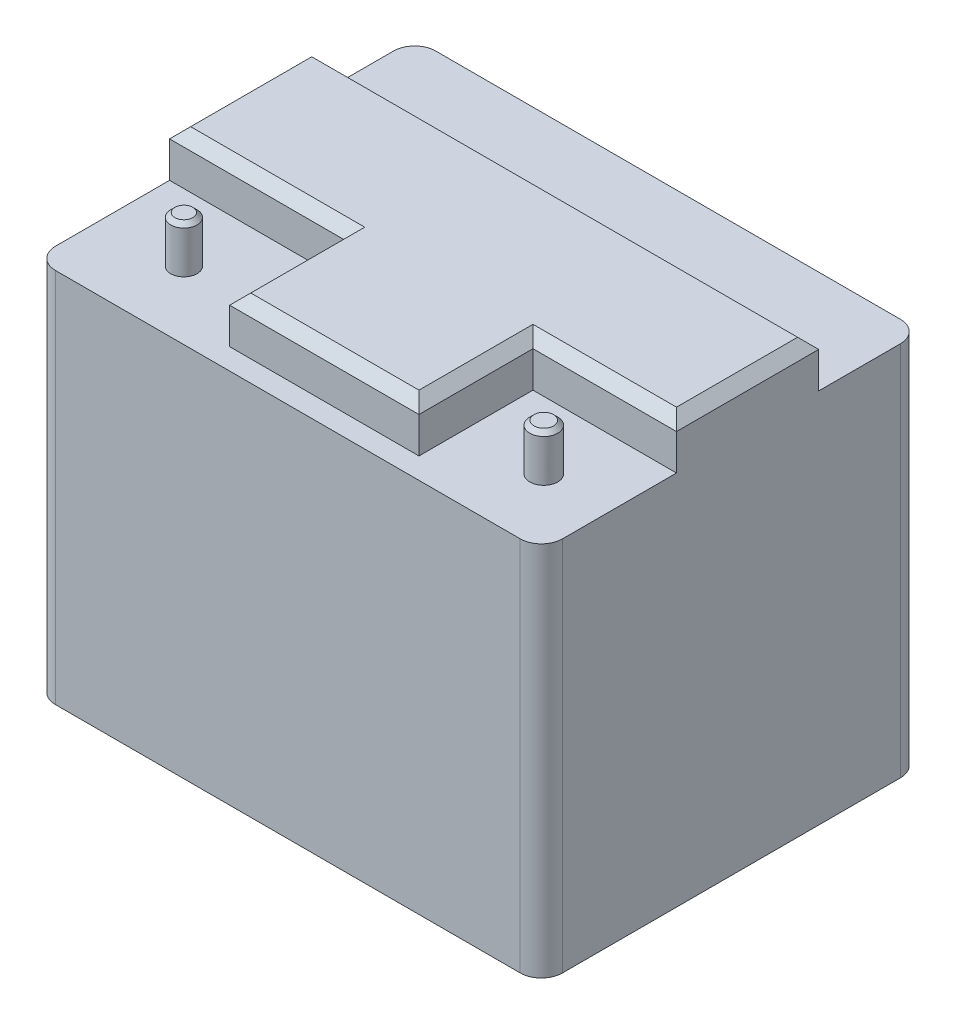
ISO-10303-21;
HEADER;
FILE_DESCRIPTION(('STEP AP214'),'2;1');
FILE_NAME('part.step','',(''),(''),'','','');
FILE_SCHEMA(('AUTOMOTIVE_DESIGN { 1 0 10303 214 1 1 1 1 }'));
ENDSEC;
DATA;
#1=APPLICATION_CONTEXT('core data for automotive mechanical design processes');
#2=APPLICATION_PROTOCOL_DEFINITION('international standard','automotive_design',2000,#1);
#3=PRODUCT_CONTEXT('',#1,'mechanical');
#4=PRODUCT('Part','Part','',(#3));
#5=PRODUCT_RELATED_PRODUCT_CATEGORY('part','',(#4));
#6=PRODUCT_DEFINITION_FORMATION('','',#4);
#7=PRODUCT_DEFINITION_CONTEXT('part definition',#1,'design');
#8=PRODUCT_DEFINITION('design','',#6,#7);
#9=PRODUCT_DEFINITION_SHAPE('','',#8);
#10=(LENGTH_UNIT() NAMED_UNIT(*) SI_UNIT(.MILLI.,.METRE.));
#11=(NAMED_UNIT(*) PLANE_ANGLE_UNIT() SI_UNIT($,.RADIAN.));
#12=(NAMED_UNIT(*) SI_UNIT($,.STERADIAN.) SOLID_ANGLE_UNIT());
#13=UNCERTAINTY_MEASURE_WITH_UNIT(LENGTH_MEASURE(1.E-05),#10,'distance_accuracy_value','');
#14=(GEOMETRIC_REPRESENTATION_CONTEXT(3) GLOBAL_UNCERTAINTY_ASSIGNED_CONTEXT((#13)) GLOBAL_UNIT_ASSIGNED_CONTEXT((#10,
#11,#12)) REPRESENTATION_CONTEXT('',''));
#15=CARTESIAN_POINT('',(0.,0.,0.));
#16=DIRECTION('',(0.,0.,1.));
#17=DIRECTION('',(1.,0.,0.));
#18=AXIS2_PLACEMENT_3D('',#15,#16,#17);
#19=CARTESIAN_POINT('',(-110.,200.,80.));
#20=DIRECTION('',(0.,-1.,0.));
#21=DIRECTION('',(0.,0.,-1.));
#22=AXIS2_PLACEMENT_3D('',#19,#20,#21);
#23=CYLINDRICAL_SURFACE('',#22,10.);
#24=CARTESIAN_POINT('',(-110.,178.,80.));
#25=DIRECTION('',(0.,1.,0.));
#26=DIRECTION('',(0.,0.,1.));
#27=AXIS2_PLACEMENT_3D('',#24,#25,#26);
#28=CIRCLE('',#27,10.);
#29=CARTESIAN_POINT('',(-120.,178.,79.9999999999999));
#30=VERTEX_POINT('',#29);
#31=CARTESIAN_POINT('',(-110.,178.,90.));
#32=VERTEX_POINT('',#31);
#33=EDGE_CURVE('E212',#30,#32,#28,.T.);
#34=ORIENTED_EDGE('',*,*,#33,.F.);
#35=DIRECTION('',(0.,-1.,0.));
#36=VECTOR('',#35,1.);
#37=CARTESIAN_POINT('',(-120.,200.,79.9999999999999));
#38=LINE('',#37,#36);
#39=CARTESIAN_POINT('',(-120.,0.,79.9999999999999));
#40=VERTEX_POINT('',#39);
#41=EDGE_CURVE('E281',#30,#40,#38,.T.);
#42=ORIENTED_EDGE('',*,*,#41,.T.);
#43=CARTESIAN_POINT('',(-110.,0.,80.));
#44=DIRECTION('',(0.,1.,0.));
#45=DIRECTION('',(0.,0.,1.));
#46=AXIS2_PLACEMENT_3D('',#43,#44,#45);
#47=CIRCLE('',#46,10.);
#48=CARTESIAN_POINT('',(-110.,0.,90.));
#49=VERTEX_POINT('',#48);
#50=EDGE_CURVE('E261',#40,#49,#47,.T.);
#51=ORIENTED_EDGE('',*,*,#50,.T.);
#52=DIRECTION('',(0.,-1.,0.));
#53=VECTOR('',#52,1.);
#54=CARTESIAN_POINT('',(-110.,200.,90.));
#55=LINE('',#54,#53);
#56=EDGE_CURVE('E279',#32,#49,#55,.T.);
#57=ORIENTED_EDGE('',*,*,#56,.F.);
#58=EDGE_LOOP('',(#34,#42,#51,#57));
#59=FACE_BOUND('',#58,.T.);
#60=ADVANCED_FACE('F35',(#59),#23,.T.);
#61=CARTESIAN_POINT('',(-110.,200.,90.));
#62=DIRECTION('',(0.,0.,-1.));
#63=DIRECTION('',(-1.,0.,0.));
#64=AXIS2_PLACEMENT_3D('',#61,#62,#63);
#65=PLANE('',#64);
#66=DIRECTION('',(1.,0.,0.));
#67=VECTOR('',#66,1.);
#68=CARTESIAN_POINT('',(0.,178.,90.));
#69=LINE('',#68,#67);
#70=CARTESIAN_POINT('',(110.,178.,90.));
#71=VERTEX_POINT('',#70);
#72=EDGE_CURVE('E214',#32,#71,#69,.T.);
#73=ORIENTED_EDGE('',*,*,#72,.F.);
#74=ORIENTED_EDGE('',*,*,#56,.T.);
#75=DIRECTION('',(1.,0.,0.));
#76=VECTOR('',#75,1.);
#77=CARTESIAN_POINT('',(-110.,0.,90.));
#78=LINE('',#77,#76);
#79=CARTESIAN_POINT('',(110.,0.,90.));
#80=VERTEX_POINT('',#79);
#81=EDGE_CURVE('E264',#49,#80,#78,.T.);
#82=ORIENTED_EDGE('',*,*,#81,.T.);
#83=DIRECTION('',(0.,-1.,0.));
#84=VECTOR('',#83,1.);
#85=CARTESIAN_POINT('',(110.,200.,90.));
#86=LINE('',#85,#84);
#87=EDGE_CURVE('E277',#71,#80,#86,.T.);
#88=ORIENTED_EDGE('',*,*,#87,.F.);
#89=EDGE_LOOP('',(#73,#74,#82,#88));
#90=FACE_BOUND('',#89,.T.);
#91=ADVANCED_FACE('F381',(#90),#65,.F.);
#92=CARTESIAN_POINT('',(110.,200.,80.));
#93=DIRECTION('',(0.,-1.,0.));
#94=DIRECTION('',(0.,0.,-1.));
#95=AXIS2_PLACEMENT_3D('',#92,#93,#94);
#96=CYLINDRICAL_SURFACE('',#95,9.99999999999999);
#97=CARTESIAN_POINT('',(110.,178.,80.));
#98=DIRECTION('',(0.,1.,0.));
#99=DIRECTION('',(0.,0.,1.));
#100=AXIS2_PLACEMENT_3D('',#97,#98,#99);
#101=CIRCLE('',#100,9.99999999999999);
#102=CARTESIAN_POINT('',(120.,178.,79.9999999999999));
#103=VERTEX_POINT('',#102);
#104=EDGE_CURVE('E216',#71,#103,#101,.T.);
#105=ORIENTED_EDGE('',*,*,#104,.F.);
#106=ORIENTED_EDGE('',*,*,#87,.T.);
#107=CARTESIAN_POINT('',(110.,0.,80.));
#108=DIRECTION('',(0.,1.,0.));
#109=DIRECTION('',(0.,0.,1.));
#110=AXIS2_PLACEMENT_3D('',#107,#108,#109);
#111=CIRCLE('',#110,9.99999999999999);
#112=CARTESIAN_POINT('',(120.,0.,79.9999999999999));
#113=VERTEX_POINT('',#112);
#114=EDGE_CURVE('E267',#80,#113,#111,.T.);
#115=ORIENTED_EDGE('',*,*,#114,.T.);
#116=DIRECTION('',(0.,-1.,0.));
#117=VECTOR('',#116,1.);
#118=CARTESIAN_POINT('',(120.,200.,79.9999999999999));
#119=LINE('',#118,#117);
#120=EDGE_CURVE('E275',#103,#113,#119,.T.);
#121=ORIENTED_EDGE('',*,*,#120,.F.);
#122=EDGE_LOOP('',(#105,#106,#115,#121));
#123=FACE_BOUND('',#122,.T.);
#124=ADVANCED_FACE('F387',(#123),#96,.T.);
#125=CARTESIAN_POINT('',(110.,200.,-80.));
#126=DIRECTION('',(0.,-1.,0.));
#127=DIRECTION('',(0.,0.,-1.));
#128=AXIS2_PLACEMENT_3D('',#125,#126,#127);
#129=CYLINDRICAL_SURFACE('',#128,9.99999999999999);
#130=CARTESIAN_POINT('',(110.,178.,-80.));
#131=DIRECTION('',(0.,1.,0.));
#132=DIRECTION('',(0.,0.,1.));
#133=AXIS2_PLACEMENT_3D('',#130,#131,#132);
#134=CIRCLE('',#133,9.99999999999999);
#135=CARTESIAN_POINT('',(120.,178.,-79.9999999999999));
#136=VERTEX_POINT('',#135);
#137=CARTESIAN_POINT('',(110.,178.,-90.));
#138=VERTEX_POINT('',#137);
#139=EDGE_CURVE('E238',#136,#138,#134,.T.);
#140=ORIENTED_EDGE('',*,*,#139,.F.);
#141=DIRECTION('',(0.,-1.,0.));
#142=VECTOR('',#141,1.);
#143=CARTESIAN_POINT('',(120.,200.,-79.9999999999999));
#144=LINE('',#143,#142);
#145=CARTESIAN_POINT('',(120.,0.,-79.9999999999999));
#146=VERTEX_POINT('',#145);
#147=EDGE_CURVE('E273',#136,#146,#144,.T.);
#148=ORIENTED_EDGE('',*,*,#147,.T.);
#149=CARTESIAN_POINT('',(110.,0.,-80.));
#150=DIRECTION('',(0.,1.,0.));
#151=DIRECTION('',(0.,0.,-1.));
#152=AXIS2_PLACEMENT_3D('',#149,#150,#151);
#153=CIRCLE('',#152,9.99999999999999);
#154=CARTESIAN_POINT('',(110.,0.,-90.));
#155=VERTEX_POINT('',#154);
#156=EDGE_CURVE('E248',#146,#155,#153,.T.);
#157=ORIENTED_EDGE('',*,*,#156,.T.);
#158=DIRECTION('',(0.,-1.,0.));
#159=VECTOR('',#158,1.);
#160=CARTESIAN_POINT('',(110.,200.,-90.));
#161=LINE('',#160,#159);
#162=EDGE_CURVE('E287',#138,#155,#161,.T.);
#163=ORIENTED_EDGE('',*,*,#162,.F.);
#164=EDGE_LOOP('',(#140,#148,#157,#163));
#165=FACE_BOUND('',#164,.T.);
#166=ADVANCED_FACE('F404',(#165),#129,.T.);
#167=CARTESIAN_POINT('',(-110.,200.,-90.));
#168=DIRECTION('',(0.,0.,1.));
#169=DIRECTION('',(1.,0.,0.));
#170=AXIS2_PLACEMENT_3D('',#167,#168,#169);
#171=PLANE('',#170);
#172=DIRECTION('',(-1.,0.,0.));
#173=VECTOR('',#172,1.);
#174=CARTESIAN_POINT('',(0.,178.,-90.));
#175=LINE('',#174,#173);
#176=CARTESIAN_POINT('',(-110.,178.,-90.));
#177=VERTEX_POINT('',#176);
#178=EDGE_CURVE('E240',#138,#177,#175,.T.);
#179=ORIENTED_EDGE('',*,*,#178,.F.);
#180=ORIENTED_EDGE('',*,*,#162,.T.);
#181=DIRECTION('',(-1.,0.,0.));
#182=VECTOR('',#181,1.);
#183=CARTESIAN_POINT('',(-110.,0.,-90.));
#184=LINE('',#183,#182);
#185=CARTESIAN_POINT('',(-110.,0.,-90.));
#186=VERTEX_POINT('',#185);
#187=EDGE_CURVE('E252',#155,#186,#184,.T.);
#188=ORIENTED_EDGE('',*,*,#187,.T.);
#189=DIRECTION('',(0.,-1.,0.));
#190=VECTOR('',#189,1.);
#191=CARTESIAN_POINT('',(-110.,200.,-90.));
#192=LINE('',#191,#190);
#193=EDGE_CURVE('E285',#177,#186,#192,.T.);
#194=ORIENTED_EDGE('',*,*,#193,.F.);
#195=EDGE_LOOP('',(#179,#180,#188,#194));
#196=FACE_BOUND('',#195,.T.);
#197=ADVANCED_FACE('F400',(#196),#171,.F.);
#198=CARTESIAN_POINT('',(-110.,200.,-80.));
#199=DIRECTION('',(0.,-1.,0.));
#200=DIRECTION('',(0.,0.,-1.));
#201=AXIS2_PLACEMENT_3D('',#198,#199,#200);
#202=CYLINDRICAL_SURFACE('',#201,10.);
#203=CARTESIAN_POINT('',(-110.,178.,-80.));
#204=DIRECTION('',(0.,1.,0.));
#205=DIRECTION('',(0.,0.,1.));
#206=AXIS2_PLACEMENT_3D('',#203,#204,#205);
#207=CIRCLE('',#206,10.);
#208=CARTESIAN_POINT('',(-120.,178.,-79.9999999999999));
#209=VERTEX_POINT('',#208);
#210=EDGE_CURVE('E242',#177,#209,#207,.T.);
#211=ORIENTED_EDGE('',*,*,#210,.F.);
#212=ORIENTED_EDGE('',*,*,#193,.T.);
#213=CARTESIAN_POINT('',(-110.,0.,-80.));
#214=DIRECTION('',(0.,1.,0.));
#215=DIRECTION('',(0.,0.,1.));
#216=AXIS2_PLACEMENT_3D('',#213,#214,#215);
#217=CIRCLE('',#216,10.);
#218=CARTESIAN_POINT('',(-120.,0.,-79.9999999999999));
#219=VERTEX_POINT('',#218);
#220=EDGE_CURVE('E255',#186,#219,#217,.T.);
#221=ORIENTED_EDGE('',*,*,#220,.T.);
#222=DIRECTION('',(0.,-1.,0.));
#223=VECTOR('',#222,1.);
#224=CARTESIAN_POINT('',(-120.,200.,-79.9999999999999));
#225=LINE('',#224,#223);
#226=EDGE_CURVE('E283',#209,#219,#225,.T.);
#227=ORIENTED_EDGE('',*,*,#226,.F.);
#228=EDGE_LOOP('',(#211,#212,#221,#227));
#229=FACE_BOUND('',#228,.T.);
#230=ADVANCED_FACE('F397',(#229),#202,.T.);
#231=CARTESIAN_POINT('',(-120.,200.,-79.9999999999999));
#232=DIRECTION('',(1.,0.,0.));
#233=DIRECTION('',(0.,0.,-1.));
#234=AXIS2_PLACEMENT_3D('',#231,#232,#233);
#235=PLANE('',#234);
#236=DIRECTION('',(0.,1.,0.));
#237=VECTOR('',#236,1.);
#238=CARTESIAN_POINT('',(-120.,178.,26.0319113315864));
#239=LINE('',#238,#237);
#240=CARTESIAN_POINT('',(-120.,178.,26.0319113315864));
#241=VERTEX_POINT('',#240);
#242=CARTESIAN_POINT('',(-120.,195.,26.0319113315864));
#243=VERTEX_POINT('',#242);
#244=EDGE_CURVE('E226',#241,#243,#239,.T.);
#245=ORIENTED_EDGE('',*,*,#244,.T.);
#246=DIRECTION('',(0.,0.,-1.));
#247=VECTOR('',#246,1.);
#248=CARTESIAN_POINT('',(-120.,195.,-79.9999999999999));
#249=LINE('',#248,#247);
#250=CARTESIAN_POINT('',(-120.,195.,-41.2987465486088));
#251=VERTEX_POINT('',#250);
#252=EDGE_CURVE('E44',#243,#251,#249,.T.);
#253=ORIENTED_EDGE('',*,*,#252,.T.);
#254=DIRECTION('',(0.,1.,0.));
#255=VECTOR('',#254,1.);
#256=CARTESIAN_POINT('',(-120.,178.,-41.2987465486088));
#257=LINE('',#256,#255);
#258=CARTESIAN_POINT('',(-120.,178.,-41.2987465486088));
#259=VERTEX_POINT('',#258);
#260=EDGE_CURVE('E244',#259,#251,#257,.T.);
#261=ORIENTED_EDGE('',*,*,#260,.F.);
#262=DIRECTION('',(0.,0.,1.));
#263=VECTOR('',#262,1.);
#264=CARTESIAN_POINT('',(-120.,178.,0.));
#265=LINE('',#264,#263);
#266=EDGE_CURVE('E222',#209,#259,#265,.T.);
#267=ORIENTED_EDGE('',*,*,#266,.F.);
#268=ORIENTED_EDGE('',*,*,#226,.T.);
#269=DIRECTION('',(0.,0.,1.));
#270=VECTOR('',#269,1.);
#271=CARTESIAN_POINT('',(-120.,0.,-79.9999999999999));
#272=LINE('',#271,#270);
#273=EDGE_CURVE('E258',#219,#40,#272,.T.);
#274=ORIENTED_EDGE('',*,*,#273,.T.);
#275=ORIENTED_EDGE('',*,*,#41,.F.);
#276=DIRECTION('',(0.,0.,1.));
#277=VECTOR('',#276,1.);
#278=CARTESIAN_POINT('',(-120.,178.,0.));
#279=LINE('',#278,#277);
#280=EDGE_CURVE('E210',#241,#30,#279,.T.);
#281=ORIENTED_EDGE('',*,*,#280,.F.);
#282=EDGE_LOOP('',(#245,#253,#261,#267,#268,#274,#275,#281));
#283=FACE_BOUND('',#282,.T.);
#284=ADVANCED_FACE('F393',(#283),#235,.F.);
#285=CARTESIAN_POINT('',(120.,200.,-79.9999999999999));
#286=DIRECTION('',(-1.,0.,0.));
#287=DIRECTION('',(0.,0.,1.));
#288=AXIS2_PLACEMENT_3D('',#285,#286,#287);
#289=PLANE('',#288);
#290=DIRECTION('',(0.,1.,0.));
#291=VECTOR('',#290,1.);
#292=CARTESIAN_POINT('',(120.,178.,-41.2987465486088));
#293=LINE('',#292,#291);
#294=CARTESIAN_POINT('',(120.,178.,-41.2987465486088));
#295=VERTEX_POINT('',#294);
#296=CARTESIAN_POINT('',(120.,195.,-41.2987465486088));
#297=VERTEX_POINT('',#296);
#298=EDGE_CURVE('E245',#295,#297,#293,.T.);
#299=ORIENTED_EDGE('',*,*,#298,.T.);
#300=DIRECTION('',(0.,0.,1.));
#301=VECTOR('',#300,1.);
#302=CARTESIAN_POINT('',(120.,195.,-79.9999999999999));
#303=LINE('',#302,#301);
#304=CARTESIAN_POINT('',(120.,195.,26.0319113315864));
#305=VERTEX_POINT('',#304);
#306=EDGE_CURVE('E318',#297,#305,#303,.T.);
#307=ORIENTED_EDGE('',*,*,#306,.T.);
#308=DIRECTION('',(0.,1.,0.));
#309=VECTOR('',#308,1.);
#310=CARTESIAN_POINT('',(120.,178.,26.0319113315864));
#311=LINE('',#310,#309);
#312=CARTESIAN_POINT('',(120.,178.,26.0319113315864));
#313=VERTEX_POINT('',#312);
#314=EDGE_CURVE('E223',#313,#305,#311,.T.);
#315=ORIENTED_EDGE('',*,*,#314,.F.);
#316=DIRECTION('',(0.,0.,-1.));
#317=VECTOR('',#316,1.);
#318=CARTESIAN_POINT('',(120.,178.,0.));
#319=LINE('',#318,#317);
#320=EDGE_CURVE('E218',#103,#313,#319,.T.);
#321=ORIENTED_EDGE('',*,*,#320,.F.);
#322=ORIENTED_EDGE('',*,*,#120,.T.);
#323=DIRECTION('',(0.,0.,-1.));
#324=VECTOR('',#323,1.);
#325=CARTESIAN_POINT('',(120.,0.,-79.9999999999999));
#326=LINE('',#325,#324);
#327=EDGE_CURVE('E270',#113,#146,#326,.T.);
#328=ORIENTED_EDGE('',*,*,#327,.T.);
#329=ORIENTED_EDGE('',*,*,#147,.F.);
#330=DIRECTION('',(0.,0.,-1.));
#331=VECTOR('',#330,1.);
#332=CARTESIAN_POINT('',(120.,178.,0.));
#333=LINE('',#332,#331);
#334=EDGE_CURVE('E236',#295,#136,#333,.T.);
#335=ORIENTED_EDGE('',*,*,#334,.F.);
#336=EDGE_LOOP('',(#299,#307,#315,#321,#322,#328,#329,#335));
#337=FACE_BOUND('',#336,.T.);
#338=ADVANCED_FACE('F396',(#337),#289,.F.);
#339=CARTESIAN_POINT('',(110.,200.,-80.));
#340=DIRECTION('',(0.,-1.,0.));
#341=DIRECTION('',(0.,0.,-1.));
#342=AXIS2_PLACEMENT_3D('',#339,#340,#341);
#343=PLANE('',#342);
#344=DIRECTION('',(1.,0.,0.));
#345=VECTOR('',#344,1.);
#346=CARTESIAN_POINT('',(110.,200.,21.0319113315863));
#347=LINE('',#346,#345);
#348=CARTESIAN_POINT('',(47.0638226631741,200.,21.0319113315863));
#349=VERTEX_POINT('',#348);
#350=CARTESIAN_POINT('',(115.,200.,21.0319113315863));
#351=VERTEX_POINT('',#350);
#352=EDGE_CURVE('E313',#349,#351,#347,.T.);
#353=ORIENTED_EDGE('',*,*,#352,.T.);
#354=DIRECTION('',(0.,0.,-1.));
#355=VECTOR('',#354,1.);
#356=CARTESIAN_POINT('',(115.,200.,-80.));
#357=LINE('',#356,#355);
#358=CARTESIAN_POINT('',(115.,200.,-36.2987465486086));
#359=VERTEX_POINT('',#358);
#360=EDGE_CURVE('E315',#351,#359,#357,.T.);
#361=ORIENTED_EDGE('',*,*,#360,.T.);
#362=DIRECTION('',(-1.,0.,0.));
#363=VECTOR('',#362,1.);
#364=CARTESIAN_POINT('',(110.,200.,-36.2987465486086));
#365=LINE('',#364,#363);
#366=CARTESIAN_POINT('',(-115.,200.,-36.2987465486086));
#367=VERTEX_POINT('',#366);
#368=EDGE_CURVE('E301',#359,#367,#365,.T.);
#369=ORIENTED_EDGE('',*,*,#368,.T.);
#370=DIRECTION('',(0.,0.,1.));
#371=VECTOR('',#370,1.);
#372=CARTESIAN_POINT('',(-115.,200.,-79.9999999999999));
#373=LINE('',#372,#371);
#374=CARTESIAN_POINT('',(-115.,200.,21.0319113315863));
#375=VERTEX_POINT('',#374);
#376=EDGE_CURVE('E303',#367,#375,#373,.T.);
#377=ORIENTED_EDGE('',*,*,#376,.T.);
#378=DIRECTION('',(1.,0.,0.));
#379=VECTOR('',#378,1.);
#380=CARTESIAN_POINT('',(110.,200.,21.0319113315863));
#381=LINE('',#380,#379);
#382=CARTESIAN_POINT('',(-32.5799020726669,200.,21.0319113315863));
#383=VERTEX_POINT('',#382);
#384=EDGE_CURVE('E305',#375,#383,#381,.T.);
#385=ORIENTED_EDGE('',*,*,#384,.T.);
#386=DIRECTION('',(0.,0.,1.));
#387=VECTOR('',#386,1.);
#388=CARTESIAN_POINT('',(-32.5799020726669,200.,79.9999999999999));
#389=LINE('',#388,#387);
#390=CARTESIAN_POINT('',(-32.5799020726669,200.,74.9999999999998));
#391=VERTEX_POINT('',#390);
#392=EDGE_CURVE('E307',#383,#391,#389,.T.);
#393=ORIENTED_EDGE('',*,*,#392,.T.);
#394=DIRECTION('',(1.,0.,0.));
#395=VECTOR('',#394,1.);
#396=CARTESIAN_POINT('',(52.0638226631742,200.,74.9999999999998));
#397=LINE('',#396,#395);
#398=CARTESIAN_POINT('',(47.063822663174,200.,74.9999999999998));
#399=VERTEX_POINT('',#398);
#400=EDGE_CURVE('E309',#391,#399,#397,.T.);
#401=ORIENTED_EDGE('',*,*,#400,.T.);
#402=DIRECTION('',(0.,0.,-1.));
#403=VECTOR('',#402,1.);
#404=CARTESIAN_POINT('',(47.0638226631741,200.,26.0319113315864));
#405=LINE('',#404,#403);
#406=EDGE_CURVE('E311',#399,#349,#405,.T.);
#407=ORIENTED_EDGE('',*,*,#406,.T.);
#408=EDGE_LOOP('',(#353,#361,#369,#377,#385,#393,#401,#407));
#409=FACE_BOUND('',#408,.T.);
#410=ADVANCED_FACE('F509',(#409),#343,.F.);
#411=CARTESIAN_POINT('',(110.,0.,-80.));
#412=DIRECTION('',(0.,-1.,0.));
#413=DIRECTION('',(0.,0.,-1.));
#414=AXIS2_PLACEMENT_3D('',#411,#412,#413);
#415=PLANE('',#414);
#416=ORIENTED_EDGE('',*,*,#156,.F.);
#417=ORIENTED_EDGE('',*,*,#327,.F.);
#418=ORIENTED_EDGE('',*,*,#114,.F.);
#419=ORIENTED_EDGE('',*,*,#81,.F.);
#420=ORIENTED_EDGE('',*,*,#50,.F.);
#421=ORIENTED_EDGE('',*,*,#273,.F.);
#422=ORIENTED_EDGE('',*,*,#220,.F.);
#423=ORIENTED_EDGE('',*,*,#187,.F.);
#424=EDGE_LOOP('',(#416,#417,#418,#419,#420,#421,#422,#423));
#425=FACE_BOUND('',#424,.T.);
#426=ADVANCED_FACE('F489',(#425),#415,.T.);
#427=CARTESIAN_POINT('',(0.,178.,-41.2987465486088));
#428=DIRECTION('',(0.,0.,1.));
#429=DIRECTION('',(1.,0.,0.));
#430=AXIS2_PLACEMENT_3D('',#427,#428,#429);
#431=PLANE('',#430);
#432=ORIENTED_EDGE('',*,*,#260,.T.);
#433=DIRECTION('',(1.,0.,0.));
#434=VECTOR('',#433,1.);
#435=CARTESIAN_POINT('',(0.,195.,-41.2987465486088));
#436=LINE('',#435,#434);
#437=EDGE_CURVE('E11',#251,#297,#436,.T.);
#438=ORIENTED_EDGE('',*,*,#437,.T.);
#439=ORIENTED_EDGE('',*,*,#298,.F.);
#440=DIRECTION('',(1.,0.,0.));
#441=VECTOR('',#440,1.);
#442=CARTESIAN_POINT('',(0.,178.,-41.2987465486088));
#443=LINE('',#442,#441);
#444=EDGE_CURVE('E233',#259,#295,#443,.T.);
#445=ORIENTED_EDGE('',*,*,#444,.F.);
#446=EDGE_LOOP('',(#432,#438,#439,#445));
#447=FACE_BOUND('',#446,.T.);
#448=ADVANCED_FACE('F457',(#447),#431,.F.);
#449=CARTESIAN_POINT('',(0.,178.,0.));
#450=DIRECTION('',(0.,1.,0.));
#451=DIRECTION('',(0.,0.,1.));
#452=AXIS2_PLACEMENT_3D('',#449,#450,#451);
#453=PLANE('',#452);
#454=ORIENTED_EDGE('',*,*,#266,.T.);
#455=ORIENTED_EDGE('',*,*,#444,.T.);
#456=ORIENTED_EDGE('',*,*,#334,.T.);
#457=ORIENTED_EDGE('',*,*,#139,.T.);
#458=ORIENTED_EDGE('',*,*,#178,.T.);
#459=ORIENTED_EDGE('',*,*,#210,.T.);
#460=EDGE_LOOP('',(#454,#455,#456,#457,#458,#459));
#461=FACE_BOUND('',#460,.T.);
#462=ADVANCED_FACE('F495',(#461),#453,.T.);
#463=CARTESIAN_POINT('',(52.0638226631742,178.,0.));
#464=DIRECTION('',(1.,0.,0.));
#465=DIRECTION('',(0.,0.,-1.));
#466=AXIS2_PLACEMENT_3D('',#463,#464,#465);
#467=PLANE('',#466);
#468=DIRECTION('',(0.,1.,0.));
#469=VECTOR('',#468,1.);
#470=CARTESIAN_POINT('',(52.0638226631742,178.,26.0319113315864));
#471=LINE('',#470,#469);
#472=CARTESIAN_POINT('',(52.0638226631742,178.,26.0319113315864));
#473=VERTEX_POINT('',#472);
#474=CARTESIAN_POINT('',(52.0638226631742,195.,26.0319113315864));
#475=VERTEX_POINT('',#474);
#476=EDGE_CURVE('E220',#473,#475,#471,.T.);
#477=ORIENTED_EDGE('',*,*,#476,.T.);
#478=DIRECTION('',(0.,0.,1.));
#479=VECTOR('',#478,1.);
#480=CARTESIAN_POINT('',(52.0638226631742,195.,79.9999999999999));
#481=LINE('',#480,#479);
#482=CARTESIAN_POINT('',(52.0638226631742,195.,79.9999999999999));
#483=VERTEX_POINT('',#482);
#484=EDGE_CURVE('E193',#475,#483,#481,.T.);
#485=ORIENTED_EDGE('',*,*,#484,.T.);
#486=DIRECTION('',(0.,1.,0.));
#487=VECTOR('',#486,1.);
#488=CARTESIAN_POINT('',(52.0638226631742,178.,79.9999999999999));
#489=LINE('',#488,#487);
#490=CARTESIAN_POINT('',(52.0638226631742,178.,79.9999999999999));
#491=VERTEX_POINT('',#490);
#492=EDGE_CURVE('E178',#491,#483,#489,.T.);
#493=ORIENTED_EDGE('',*,*,#492,.F.);
#494=DIRECTION('',(0.,0.,-1.));
#495=VECTOR('',#494,1.);
#496=CARTESIAN_POINT('',(52.0638226631742,178.,0.));
#497=LINE('',#496,#495);
#498=EDGE_CURVE('E186',#491,#473,#497,.T.);
#499=ORIENTED_EDGE('',*,*,#498,.T.);
#500=EDGE_LOOP('',(#477,#485,#493,#499));
#501=FACE_BOUND('',#500,.T.);
#502=ADVANCED_FACE('F190',(#501),#467,.T.);
#503=CARTESIAN_POINT('',(0.,178.,26.0319113315864));
#504=DIRECTION('',(0.,0.,-1.));
#505=DIRECTION('',(-1.,0.,0.));
#506=AXIS2_PLACEMENT_3D('',#503,#504,#505);
#507=PLANE('',#506);
#508=ORIENTED_EDGE('',*,*,#314,.T.);
#509=DIRECTION('',(-1.,0.,0.));
#510=VECTOR('',#509,1.);
#511=CARTESIAN_POINT('',(0.,195.,26.0319113315864));
#512=LINE('',#511,#510);
#513=EDGE_CURVE('E321',#305,#475,#512,.T.);
#514=ORIENTED_EDGE('',*,*,#513,.T.);
#515=ORIENTED_EDGE('',*,*,#476,.F.);
#516=DIRECTION('',(-1.,0.,0.));
#517=VECTOR('',#516,1.);
#518=CARTESIAN_POINT('',(0.,178.,26.0319113315864));
#519=LINE('',#518,#517);
#520=EDGE_CURVE('E194',#313,#473,#519,.T.);
#521=ORIENTED_EDGE('',*,*,#520,.F.);
#522=EDGE_LOOP('',(#508,#514,#515,#521));
#523=FACE_BOUND('',#522,.T.);
#524=ADVANCED_FACE('F469',(#523),#507,.F.);
#525=DIRECTION('',(0.,1.,0.));
#526=VECTOR('',#525,1.);
#527=CARTESIAN_POINT('',(-37.579902072667,178.,26.0319113315864));
#528=LINE('',#527,#526);
#529=CARTESIAN_POINT('',(-37.579902072667,178.,26.0319113315864));
#530=VERTEX_POINT('',#529);
#531=CARTESIAN_POINT('',(-37.579902072667,195.,26.0319113315864));
#532=VERTEX_POINT('',#531);
#533=EDGE_CURVE('E228',#530,#532,#528,.T.);
#534=ORIENTED_EDGE('',*,*,#533,.T.);
#535=DIRECTION('',(-1.,0.,0.));
#536=VECTOR('',#535,1.);
#537=CARTESIAN_POINT('',(0.,195.,26.0319113315864));
#538=LINE('',#537,#536);
#539=EDGE_CURVE('E59',#532,#243,#538,.T.);
#540=ORIENTED_EDGE('',*,*,#539,.T.);
#541=ORIENTED_EDGE('',*,*,#244,.F.);
#542=EDGE_CURVE('E207',#530,#241,#519,.T.);
#543=ORIENTED_EDGE('',*,*,#542,.F.);
#544=EDGE_LOOP('',(#534,#540,#541,#543));
#545=FACE_BOUND('',#544,.T.);
#546=ADVANCED_FACE('F376',(#545),#507,.F.);
#547=CARTESIAN_POINT('',(-37.579902072667,178.,0.));
#548=DIRECTION('',(-1.,0.,0.));
#549=DIRECTION('',(0.,0.,1.));
#550=AXIS2_PLACEMENT_3D('',#547,#548,#549);
#551=PLANE('',#550);
#552=DIRECTION('',(0.,1.,0.));
#553=VECTOR('',#552,1.);
#554=CARTESIAN_POINT('',(-37.579902072667,178.,79.9999999999999));
#555=LINE('',#554,#553);
#556=CARTESIAN_POINT('',(-37.579902072667,178.,79.9999999999999));
#557=VERTEX_POINT('',#556);
#558=CARTESIAN_POINT('',(-37.579902072667,195.,79.9999999999999));
#559=VERTEX_POINT('',#558);
#560=EDGE_CURVE('E181',#557,#559,#555,.T.);
#561=ORIENTED_EDGE('',*,*,#560,.T.);
#562=DIRECTION('',(0.,0.,-1.));
#563=VECTOR('',#562,1.);
#564=CARTESIAN_POINT('',(-37.579902072667,195.,26.0319113315864));
#565=LINE('',#564,#563);
#566=EDGE_CURVE('E326',#559,#532,#565,.T.);
#567=ORIENTED_EDGE('',*,*,#566,.T.);
#568=ORIENTED_EDGE('',*,*,#533,.F.);
#569=DIRECTION('',(0.,0.,1.));
#570=VECTOR('',#569,1.);
#571=CARTESIAN_POINT('',(-37.579902072667,178.,0.));
#572=LINE('',#571,#570);
#573=EDGE_CURVE('E185',#530,#557,#572,.T.);
#574=ORIENTED_EDGE('',*,*,#573,.T.);
#575=EDGE_LOOP('',(#561,#567,#568,#574));
#576=FACE_BOUND('',#575,.T.);
#577=ADVANCED_FACE('F367',(#576),#551,.T.);
#578=CARTESIAN_POINT('',(-81.4244912580417,178.,57.8134498159632));
#579=DIRECTION('',(0.,1.,0.));
#580=DIRECTION('',(0.,0.,1.));
#581=AXIS2_PLACEMENT_3D('',#578,#579,#580);
#582=CYLINDRICAL_SURFACE('',#581,6.23826374406272);
#583=CARTESIAN_POINT('',(-81.4244912580417,198.,57.8134498159632));
#584=DIRECTION('',(0.,-1.,0.));
#585=DIRECTION('',(0.,0.,-1.));
#586=AXIS2_PLACEMENT_3D('',#583,#584,#585);
#587=CIRCLE('',#586,6.23826374406272);
#588=CARTESIAN_POINT('',(-81.4244912580417,198.,51.5751860719005));
#589=VERTEX_POINT('',#588);
#590=EDGE_CURVE('E298',#589,#589,#587,.T.);
#591=ORIENTED_EDGE('',*,*,#590,.T.);
#592=EDGE_LOOP('',(#591));
#593=FACE_BOUND('',#592,.T.);
#594=CARTESIAN_POINT('',(-81.4244912580417,178.,57.8134498159632));
#595=DIRECTION('',(0.,1.,0.));
#596=DIRECTION('',(0.,0.,1.));
#597=AXIS2_PLACEMENT_3D('',#594,#595,#596);
#598=CIRCLE('',#597,6.23826374406272);
#599=CARTESIAN_POINT('',(-81.4244912580417,178.,64.0517135600259));
#600=VERTEX_POINT('',#599);
#601=EDGE_CURVE('E199',#600,#600,#598,.T.);
#602=ORIENTED_EDGE('',*,*,#601,.T.);
#603=EDGE_LOOP('',(#602));
#604=FACE_BOUND('',#603,.T.);
#605=ADVANCED_FACE('F365',(#593,#604),#582,.T.);
#606=CARTESIAN_POINT('',(88.9580872516716,178.,57.8134498159632));
#607=DIRECTION('',(0.,1.,0.));
#608=DIRECTION('',(0.,0.,1.));
#609=AXIS2_PLACEMENT_3D('',#606,#607,#608);
#610=CYLINDRICAL_SURFACE('',#609,6.62815522806664);
#611=CARTESIAN_POINT('',(88.9580872516716,198.,57.8134498159632));
#612=DIRECTION('',(0.,-1.,0.));
#613=DIRECTION('',(0.,0.,-1.));
#614=AXIS2_PLACEMENT_3D('',#611,#612,#613);
#615=CIRCLE('',#614,6.62815522806664);
#616=CARTESIAN_POINT('',(88.9580872516716,198.,51.1852945878966));
#617=VERTEX_POINT('',#616);
#618=EDGE_CURVE('E292',#617,#617,#615,.T.);
#619=ORIENTED_EDGE('',*,*,#618,.T.);
#620=EDGE_LOOP('',(#619));
#621=FACE_BOUND('',#620,.T.);
#622=CARTESIAN_POINT('',(88.9580872516716,178.,57.8134498159632));
#623=DIRECTION('',(0.,1.,0.));
#624=DIRECTION('',(0.,0.,1.));
#625=AXIS2_PLACEMENT_3D('',#622,#623,#624);
#626=CIRCLE('',#625,6.62815522806664);
#627=CARTESIAN_POINT('',(88.9580872516716,178.,64.4416050440298));
#628=VERTEX_POINT('',#627);
#629=EDGE_CURVE('E202',#628,#628,#626,.T.);
#630=ORIENTED_EDGE('',*,*,#629,.T.);
#631=EDGE_LOOP('',(#630));
#632=FACE_BOUND('',#631,.T.);
#633=ADVANCED_FACE('F357',(#621,#632),#610,.T.);
#634=CARTESIAN_POINT('',(0.,178.,79.9999999999999));
#635=DIRECTION('',(0.,0.,1.));
#636=DIRECTION('',(1.,0.,0.));
#637=AXIS2_PLACEMENT_3D('',#634,#635,#636);
#638=PLANE('',#637);
#639=ORIENTED_EDGE('',*,*,#492,.T.);
#640=DIRECTION('',(-1.,0.,0.));
#641=VECTOR('',#640,1.);
#642=CARTESIAN_POINT('',(-37.579902072667,195.,79.9999999999999));
#643=LINE('',#642,#641);
#644=EDGE_CURVE('E324',#483,#559,#643,.T.);
#645=ORIENTED_EDGE('',*,*,#644,.T.);
#646=ORIENTED_EDGE('',*,*,#560,.F.);
#647=DIRECTION('',(1.,0.,0.));
#648=VECTOR('',#647,1.);
#649=CARTESIAN_POINT('',(0.,178.,79.9999999999999));
#650=LINE('',#649,#648);
#651=EDGE_CURVE('E175',#557,#491,#650,.T.);
#652=ORIENTED_EDGE('',*,*,#651,.T.);
#653=EDGE_LOOP('',(#639,#645,#646,#652));
#654=FACE_BOUND('',#653,.T.);
#655=ADVANCED_FACE('F177',(#654),#638,.T.);
#656=CARTESIAN_POINT('',(0.,178.,0.));
#657=DIRECTION('',(0.,1.,0.));
#658=DIRECTION('',(0.,0.,1.));
#659=AXIS2_PLACEMENT_3D('',#656,#657,#658);
#660=PLANE('',#659);
#661=ORIENTED_EDGE('',*,*,#629,.F.);
#662=EDGE_LOOP('',(#661));
#663=FACE_BOUND('',#662,.T.);
#664=ORIENTED_EDGE('',*,*,#601,.F.);
#665=EDGE_LOOP('',(#664));
#666=FACE_BOUND('',#665,.T.);
#667=ORIENTED_EDGE('',*,*,#498,.F.);
#668=ORIENTED_EDGE('',*,*,#651,.F.);
#669=ORIENTED_EDGE('',*,*,#573,.F.);
#670=ORIENTED_EDGE('',*,*,#542,.T.);
#671=ORIENTED_EDGE('',*,*,#280,.T.);
#672=ORIENTED_EDGE('',*,*,#33,.T.);
#673=ORIENTED_EDGE('',*,*,#72,.T.);
#674=ORIENTED_EDGE('',*,*,#104,.T.);
#675=ORIENTED_EDGE('',*,*,#320,.T.);
#676=ORIENTED_EDGE('',*,*,#520,.T.);
#677=EDGE_LOOP('',(#667,#668,#669,#670,#671,#672,#673,#674,#675,#676));
#678=FACE_BOUND('',#677,.T.);
#679=ADVANCED_FACE('F197',(#663,#666,#678),#660,.T.);
#680=CARTESIAN_POINT('',(88.9580872516716,200.,57.8134498159632));
#681=DIRECTION('',(0.,-1.,0.));
#682=DIRECTION('',(0.,0.,-1.));
#683=AXIS2_PLACEMENT_3D('',#680,#681,#682);
#684=CIRCLE('',#683,4.62815522806664);
#685=CARTESIAN_POINT('',(88.9580872516716,200.,53.1852945878965));
#686=VERTEX_POINT('',#685);
#687=EDGE_CURVE('E289',#686,#686,#684,.F.);
#688=ORIENTED_EDGE('',*,*,#687,.T.);
#689=EDGE_LOOP('',(#688));
#690=FACE_BOUND('',#689,.T.);
#691=ADVANCED_FACE('F361',(#690),#343,.F.);
#692=CARTESIAN_POINT('',(-81.4244912580417,200.,57.8134498159632));
#693=DIRECTION('',(0.,-1.,0.));
#694=DIRECTION('',(0.,0.,-1.));
#695=AXIS2_PLACEMENT_3D('',#692,#693,#694);
#696=CIRCLE('',#695,4.23826374406278);
#697=CARTESIAN_POINT('',(-81.4244912580417,200.,53.5751860719004));
#698=VERTEX_POINT('',#697);
#699=EDGE_CURVE('E295',#698,#698,#696,.F.);
#700=ORIENTED_EDGE('',*,*,#699,.T.);
#701=EDGE_LOOP('',(#700));
#702=FACE_BOUND('',#701,.T.);
#703=ADVANCED_FACE('F413',(#702),#343,.F.);
#704=CARTESIAN_POINT('',(88.9580872516716,200.,57.8134498159632));
#705=DIRECTION('',(0.,-1.,0.));
#706=DIRECTION('',(0.,0.,-1.));
#707=AXIS2_PLACEMENT_3D('',#704,#705,#706);
#708=CONICAL_SURFACE('',#707,4.62815522806664,0.78539816339744);
#709=ORIENTED_EDGE('',*,*,#618,.F.);
#710=EDGE_LOOP('',(#709));
#711=FACE_BOUND('',#710,.T.);
#712=ORIENTED_EDGE('',*,*,#687,.F.);
#713=EDGE_LOOP('',(#712));
#714=FACE_BOUND('',#713,.T.);
#715=ADVANCED_FACE('F409',(#711,#714),#708,.T.);
#716=CARTESIAN_POINT('',(-81.4244912580417,200.,57.8134498159632));
#717=DIRECTION('',(0.,-1.,0.));
#718=DIRECTION('',(0.,0.,-1.));
#719=AXIS2_PLACEMENT_3D('',#716,#717,#718);
#720=CONICAL_SURFACE('',#719,4.23826374406278,0.785398163397442);
#721=ORIENTED_EDGE('',*,*,#590,.F.);
#722=EDGE_LOOP('',(#721));
#723=FACE_BOUND('',#722,.T.);
#724=ORIENTED_EDGE('',*,*,#699,.F.);
#725=EDGE_LOOP('',(#724));
#726=FACE_BOUND('',#725,.T.);
#727=ADVANCED_FACE('F412',(#723,#726),#720,.T.);
#728=CARTESIAN_POINT('',(-32.5799020726669,200.,-80.));
#729=DIRECTION('',(-0.707106781186544,0.70710678118655,0.));
#730=DIRECTION('',(0.,0.,-1.));
#731=AXIS2_PLACEMENT_3D('',#728,#729,#730);
#732=PLANE('',#731);
#733=DIRECTION('',(-0.577350269189627,-0.577350269189622,0.577350269189628));
#734=VECTOR('',#733,1.);
#735=CARTESIAN_POINT('',(1.09740170452875,233.677303777195,-12.6453924456094));
#736=LINE('',#735,#734);
#737=EDGE_CURVE('E345',#532,#383,#736,.F.);
#738=ORIENTED_EDGE('',*,*,#737,.F.);
#739=ORIENTED_EDGE('',*,*,#566,.F.);
#740=DIRECTION('',(0.577350269189627,0.577350269189623,-0.577350269189627));
#741=VECTOR('',#740,1.);
#742=CARTESIAN_POINT('',(19.086764594,251.666666666666,23.3333333333329));
#743=LINE('',#742,#741);
#744=EDGE_CURVE('E39',#391,#559,#743,.F.);
#745=ORIENTED_EDGE('',*,*,#744,.F.);
#746=ORIENTED_EDGE('',*,*,#392,.F.);
#747=EDGE_LOOP('',(#738,#739,#745,#746));
#748=FACE_BOUND('',#747,.T.);
#749=ADVANCED_FACE('F37',(#748),#732,.T.);
#750=CARTESIAN_POINT('',(110.,200.,74.9999999999998));
#751=DIRECTION('',(0.,0.70710678118655,0.707106781186544));
#752=DIRECTION('',(-1.,0.,0.));
#753=AXIS2_PLACEMENT_3D('',#750,#751,#752);
#754=PLANE('',#753);
#755=ORIENTED_EDGE('',*,*,#744,.T.);
#756=ORIENTED_EDGE('',*,*,#644,.F.);
#757=DIRECTION('',(-0.57735026918963,0.577350269189622,-0.577350269189627));
#758=VECTOR('',#757,1.);
#759=CARTESIAN_POINT('',(68.0425484421163,179.021274221058,95.9787257789419));
#760=LINE('',#759,#758);
#761=EDGE_CURVE('E343',#399,#483,#760,.F.);
#762=ORIENTED_EDGE('',*,*,#761,.F.);
#763=ORIENTED_EDGE('',*,*,#400,.F.);
#764=EDGE_LOOP('',(#755,#756,#762,#763));
#765=FACE_BOUND('',#764,.T.);
#766=ADVANCED_FACE('F440',(#765),#754,.T.);
#767=CARTESIAN_POINT('',(0.,195.,26.0319113315864));
#768=DIRECTION('',(0.,-0.707106781186551,-0.707106781186544));
#769=DIRECTION('',(-1.,0.,0.));
#770=AXIS2_PLACEMENT_3D('',#767,#768,#769);
#771=PLANE('',#770);
#772=ORIENTED_EDGE('',*,*,#737,.T.);
#773=ORIENTED_EDGE('',*,*,#384,.F.);
#774=DIRECTION('',(0.577350269189627,0.577350269189622,-0.577350269189628));
#775=VECTOR('',#774,1.);
#776=CARTESIAN_POINT('',(-81.3226962228043,233.677303777195,-12.6453924456094));
#777=LINE('',#776,#775);
#778=EDGE_CURVE('E340',#243,#375,#777,.T.);
#779=ORIENTED_EDGE('',*,*,#778,.F.);
#780=ORIENTED_EDGE('',*,*,#539,.F.);
#781=EDGE_LOOP('',(#772,#773,#779,#780));
#782=FACE_BOUND('',#781,.T.);
#783=ADVANCED_FACE('F437',(#782),#771,.F.);
#784=CARTESIAN_POINT('',(47.0638226631741,200.,-80.));
#785=DIRECTION('',(0.707106781186543,0.707106781186552,0.));
#786=DIRECTION('',(0.,0.,1.));
#787=AXIS2_PLACEMENT_3D('',#784,#785,#786);
#788=PLANE('',#787);
#789=ORIENTED_EDGE('',*,*,#761,.T.);
#790=ORIENTED_EDGE('',*,*,#484,.F.);
#791=DIRECTION('',(0.577350269189629,-0.577350269189621,0.577350269189627));
#792=VECTOR('',#791,1.);
#793=CARTESIAN_POINT('',(34.7092151087826,212.354607554391,8.67730377719486));
#794=LINE('',#793,#792);
#795=EDGE_CURVE('E337',#349,#475,#794,.T.);
#796=ORIENTED_EDGE('',*,*,#795,.F.);
#797=ORIENTED_EDGE('',*,*,#406,.F.);
#798=EDGE_LOOP('',(#789,#790,#796,#797));
#799=FACE_BOUND('',#798,.T.);
#800=ADVANCED_FACE('F433',(#799),#788,.T.);
#801=CARTESIAN_POINT('',(-115.,200.,-79.9999999999999));
#802=DIRECTION('',(0.707106781186544,-0.70710678118655,0.));
#803=DIRECTION('',(0.,0.,1.));
#804=AXIS2_PLACEMENT_3D('',#801,#802,#803);
#805=PLANE('',#804);
#806=ORIENTED_EDGE('',*,*,#778,.T.);
#807=ORIENTED_EDGE('',*,*,#376,.F.);
#808=DIRECTION('',(0.577350269189627,0.577350269189622,0.577350269189629));
#809=VECTOR('',#808,1.);
#810=CARTESIAN_POINT('',(-79.9999999999998,235.,-1.29874654860851));
#811=LINE('',#810,#809);
#812=EDGE_CURVE('E334',#251,#367,#811,.T.);
#813=ORIENTED_EDGE('',*,*,#812,.F.);
#814=ORIENTED_EDGE('',*,*,#252,.F.);
#815=EDGE_LOOP('',(#806,#807,#813,#814));
#816=FACE_BOUND('',#815,.T.);
#817=ADVANCED_FACE('F429',(#816),#805,.F.);
#818=CARTESIAN_POINT('',(0.,195.,26.0319113315864));
#819=DIRECTION('',(0.,-0.707106781186551,-0.707106781186544));
#820=DIRECTION('',(-1.,0.,0.));
#821=AXIS2_PLACEMENT_3D('',#818,#819,#820);
#822=PLANE('',#821);
#823=ORIENTED_EDGE('',*,*,#795,.T.);
#824=ORIENTED_EDGE('',*,*,#513,.F.);
#825=DIRECTION('',(-0.577350269189628,0.577350269189622,-0.577350269189628));
#826=VECTOR('',#825,1.);
#827=CARTESIAN_POINT('',(79.9999999999997,235.,-13.9680886684139));
#828=LINE('',#827,#826);
#829=EDGE_CURVE('E332',#351,#305,#828,.F.);
#830=ORIENTED_EDGE('',*,*,#829,.F.);
#831=ORIENTED_EDGE('',*,*,#352,.F.);
#832=EDGE_LOOP('',(#823,#824,#830,#831));
#833=FACE_BOUND('',#832,.T.);
#834=ADVANCED_FACE('F425',(#833),#822,.F.);
#835=CARTESIAN_POINT('',(0.,195.,-41.2987465486088));
#836=DIRECTION('',(0.,-0.707106781186552,0.707106781186543));
#837=DIRECTION('',(1.,0.,0.));
#838=AXIS2_PLACEMENT_3D('',#835,#836,#837);
#839=PLANE('',#838);
#840=ORIENTED_EDGE('',*,*,#812,.T.);
#841=ORIENTED_EDGE('',*,*,#368,.F.);
#842=DIRECTION('',(0.577350269189628,-0.577350269189622,-0.577350269189628));
#843=VECTOR('',#842,1.);
#844=CARTESIAN_POINT('',(79.9999999999997,235.,-1.29874654860847));
#845=LINE('',#844,#843);
#846=EDGE_CURVE('E330',#297,#359,#845,.F.);
#847=ORIENTED_EDGE('',*,*,#846,.F.);
#848=ORIENTED_EDGE('',*,*,#437,.F.);
#849=EDGE_LOOP('',(#840,#841,#847,#848));
#850=FACE_BOUND('',#849,.T.);
#851=ADVANCED_FACE('F421',(#850),#839,.F.);
#852=CARTESIAN_POINT('',(115.,200.,-80.));
#853=DIRECTION('',(-0.707106781186544,-0.707106781186551,0.));
#854=DIRECTION('',(0.,0.,-1.));
#855=AXIS2_PLACEMENT_3D('',#852,#853,#854);
#856=PLANE('',#855);
#857=ORIENTED_EDGE('',*,*,#829,.T.);
#858=ORIENTED_EDGE('',*,*,#306,.F.);
#859=ORIENTED_EDGE('',*,*,#846,.T.);
#860=ORIENTED_EDGE('',*,*,#360,.F.);
#861=EDGE_LOOP('',(#857,#858,#859,#860));
#862=FACE_BOUND('',#861,.T.);
#863=ADVANCED_FACE('F418',(#862),#856,.F.);
#864=CLOSED_SHELL('',(#60,#91,#124,#166,#197,#230,#284,#338,#410,#426,#448,#462,#502,#524,#546,
#577,#605,#633,#655,#679,#691,#703,#715,#727,#749,#766,#783,#800,#817,#834,#851,#863));
#865=MANIFOLD_SOLID_BREP('B2',#864);
#866=ADVANCED_BREP_SHAPE_REPRESENTATION('',(#18,#865),#14);
#867=SHAPE_DEFINITION_REPRESENTATION(#9,#866);
ENDSEC;
END-ISO-10303-21;
